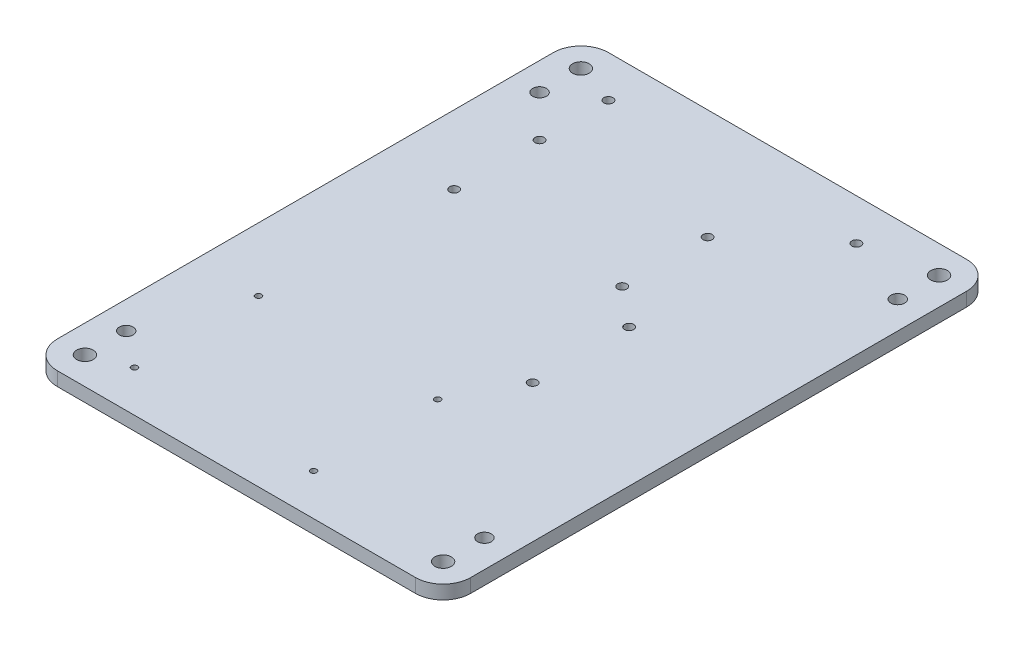
ISO-10303-21;
HEADER;
FILE_DESCRIPTION(('STEP AP214'),'2;1');
FILE_NAME('part.step','',(''),(''),'','','');
FILE_SCHEMA(('AUTOMOTIVE_DESIGN { 1 0 10303 214 1 1 1 1 }'));
ENDSEC;
DATA;
#1=APPLICATION_CONTEXT('core data for automotive mechanical design processes');
#2=APPLICATION_PROTOCOL_DEFINITION('international standard','automotive_design',2000,#1);
#3=PRODUCT_CONTEXT('',#1,'mechanical');
#4=PRODUCT('Part','Part','',(#3));
#5=PRODUCT_RELATED_PRODUCT_CATEGORY('part','',(#4));
#6=PRODUCT_DEFINITION_FORMATION('','',#4);
#7=PRODUCT_DEFINITION_CONTEXT('part definition',#1,'design');
#8=PRODUCT_DEFINITION('design','',#6,#7);
#9=PRODUCT_DEFINITION_SHAPE('','',#8);
#10=(LENGTH_UNIT() NAMED_UNIT(*) SI_UNIT(.MILLI.,.METRE.));
#11=(NAMED_UNIT(*) PLANE_ANGLE_UNIT() SI_UNIT($,.RADIAN.));
#12=(NAMED_UNIT(*) SI_UNIT($,.STERADIAN.) SOLID_ANGLE_UNIT());
#13=UNCERTAINTY_MEASURE_WITH_UNIT(LENGTH_MEASURE(1.E-05),#10,'distance_accuracy_value','');
#14=(GEOMETRIC_REPRESENTATION_CONTEXT(3) GLOBAL_UNCERTAINTY_ASSIGNED_CONTEXT((#13)) GLOBAL_UNIT_ASSIGNED_CONTEXT((#10,
#11,#12)) REPRESENTATION_CONTEXT('',''));
#15=CARTESIAN_POINT('',(0.,0.,0.));
#16=DIRECTION('',(0.,0.,1.));
#17=DIRECTION('',(1.,0.,0.));
#18=AXIS2_PLACEMENT_3D('',#15,#16,#17);
#19=CARTESIAN_POINT('',(0.,10.,0.));
#20=DIRECTION('',(-1.,0.,0.));
#21=DIRECTION('',(0.,0.,1.));
#22=AXIS2_PLACEMENT_3D('',#19,#20,#21);
#23=PLANE('',#22);
#24=DIRECTION('',(0.,0.,1.));
#25=VECTOR('',#24,1.);
#26=CARTESIAN_POINT('',(0.,10.,0.));
#27=LINE('',#26,#25);
#28=CARTESIAN_POINT('',(0.,10.,10.));
#29=VERTEX_POINT('',#28);
#30=CARTESIAN_POINT('',(0.,10.,190.));
#31=VERTEX_POINT('',#30);
#32=EDGE_CURVE('E133',#29,#31,#27,.T.);
#33=ORIENTED_EDGE('',*,*,#32,.T.);
#34=DIRECTION('',(0.,1.,0.));
#35=VECTOR('',#34,1.);
#36=CARTESIAN_POINT('',(0.,10.,190.));
#37=LINE('',#36,#35);
#38=CARTESIAN_POINT('',(0.,15.,190.));
#39=VERTEX_POINT('',#38);
#40=EDGE_CURVE('E111',#31,#39,#37,.T.);
#41=ORIENTED_EDGE('',*,*,#40,.T.);
#42=DIRECTION('',(0.,0.,1.));
#43=VECTOR('',#42,1.);
#44=CARTESIAN_POINT('',(0.,15.,0.));
#45=LINE('',#44,#43);
#46=CARTESIAN_POINT('',(0.,15.,10.));
#47=VERTEX_POINT('',#46);
#48=EDGE_CURVE('E140',#47,#39,#45,.T.);
#49=ORIENTED_EDGE('',*,*,#48,.F.);
#50=DIRECTION('',(0.,1.,0.));
#51=VECTOR('',#50,1.);
#52=CARTESIAN_POINT('',(0.,10.,10.));
#53=LINE('',#52,#51);
#54=EDGE_CURVE('E161',#29,#47,#53,.T.);
#55=ORIENTED_EDGE('',*,*,#54,.F.);
#56=EDGE_LOOP('',(#33,#41,#49,#55));
#57=FACE_BOUND('',#56,.T.);
#58=ADVANCED_FACE('F40',(#57),#23,.T.);
#59=CARTESIAN_POINT('',(0.,10.,0.));
#60=DIRECTION('',(0.,0.,-1.));
#61=DIRECTION('',(-1.,0.,0.));
#62=AXIS2_PLACEMENT_3D('',#59,#60,#61);
#63=PLANE('',#62);
#64=DIRECTION('',(-1.,0.,0.));
#65=VECTOR('',#64,1.);
#66=CARTESIAN_POINT('',(0.,10.,0.));
#67=LINE('',#66,#65);
#68=CARTESIAN_POINT('',(140.,10.,0.));
#69=VERTEX_POINT('',#68);
#70=CARTESIAN_POINT('',(10.,10.,0.));
#71=VERTEX_POINT('',#70);
#72=EDGE_CURVE('E12',#69,#71,#67,.T.);
#73=ORIENTED_EDGE('',*,*,#72,.T.);
#74=DIRECTION('',(0.,1.,0.));
#75=VECTOR('',#74,1.);
#76=CARTESIAN_POINT('',(10.,10.,0.));
#77=LINE('',#76,#75);
#78=CARTESIAN_POINT('',(10.,15.,0.));
#79=VERTEX_POINT('',#78);
#80=EDGE_CURVE('E158',#71,#79,#77,.T.);
#81=ORIENTED_EDGE('',*,*,#80,.T.);
#82=DIRECTION('',(-1.,0.,0.));
#83=VECTOR('',#82,1.);
#84=CARTESIAN_POINT('',(0.,15.,0.));
#85=LINE('',#84,#83);
#86=CARTESIAN_POINT('',(140.,15.,0.));
#87=VERTEX_POINT('',#86);
#88=EDGE_CURVE('E43',#87,#79,#85,.T.);
#89=ORIENTED_EDGE('',*,*,#88,.F.);
#90=DIRECTION('',(0.,1.,0.));
#91=VECTOR('',#90,1.);
#92=CARTESIAN_POINT('',(140.,10.,0.));
#93=LINE('',#92,#91);
#94=EDGE_CURVE('E56',#69,#87,#93,.T.);
#95=ORIENTED_EDGE('',*,*,#94,.F.);
#96=EDGE_LOOP('',(#73,#81,#89,#95));
#97=FACE_BOUND('',#96,.T.);
#98=ADVANCED_FACE('F156',(#97),#63,.T.);
#99=CARTESIAN_POINT('',(150.,10.,0.));
#100=DIRECTION('',(1.,0.,0.));
#101=DIRECTION('',(0.,0.,-1.));
#102=AXIS2_PLACEMENT_3D('',#99,#100,#101);
#103=PLANE('',#102);
#104=DIRECTION('',(0.,0.,-1.));
#105=VECTOR('',#104,1.);
#106=CARTESIAN_POINT('',(150.,10.,0.));
#107=LINE('',#106,#105);
#108=CARTESIAN_POINT('',(150.,10.,190.));
#109=VERTEX_POINT('',#108);
#110=CARTESIAN_POINT('',(150.,10.,10.));
#111=VERTEX_POINT('',#110);
#112=EDGE_CURVE('E48',#109,#111,#107,.T.);
#113=ORIENTED_EDGE('',*,*,#112,.T.);
#114=DIRECTION('',(0.,1.,0.));
#115=VECTOR('',#114,1.);
#116=CARTESIAN_POINT('',(150.,10.,10.));
#117=LINE('',#116,#115);
#118=CARTESIAN_POINT('',(150.,15.,10.));
#119=VERTEX_POINT('',#118);
#120=EDGE_CURVE('E164',#111,#119,#117,.T.);
#121=ORIENTED_EDGE('',*,*,#120,.T.);
#122=DIRECTION('',(0.,0.,-1.));
#123=VECTOR('',#122,1.);
#124=CARTESIAN_POINT('',(150.,15.,0.));
#125=LINE('',#124,#123);
#126=CARTESIAN_POINT('',(150.,15.,190.));
#127=VERTEX_POINT('',#126);
#128=EDGE_CURVE('E144',#127,#119,#125,.T.);
#129=ORIENTED_EDGE('',*,*,#128,.F.);
#130=DIRECTION('',(0.,1.,0.));
#131=VECTOR('',#130,1.);
#132=CARTESIAN_POINT('',(150.,10.,190.));
#133=LINE('',#132,#131);
#134=EDGE_CURVE('E64',#109,#127,#133,.T.);
#135=ORIENTED_EDGE('',*,*,#134,.F.);
#136=EDGE_LOOP('',(#113,#121,#129,#135));
#137=FACE_BOUND('',#136,.T.);
#138=ADVANCED_FACE('F315',(#137),#103,.T.);
#139=CARTESIAN_POINT('',(0.,10.,200.));
#140=DIRECTION('',(0.,0.,1.));
#141=DIRECTION('',(1.,0.,0.));
#142=AXIS2_PLACEMENT_3D('',#139,#140,#141);
#143=PLANE('',#142);
#144=DIRECTION('',(0.,1.,0.));
#145=VECTOR('',#144,1.);
#146=CARTESIAN_POINT('',(10.,10.,200.));
#147=LINE('',#146,#145);
#148=CARTESIAN_POINT('',(10.,10.,200.));
#149=VERTEX_POINT('',#148);
#150=CARTESIAN_POINT('',(10.,15.,200.));
#151=VERTEX_POINT('',#150);
#152=EDGE_CURVE('E108',#149,#151,#147,.T.);
#153=ORIENTED_EDGE('',*,*,#152,.F.);
#154=DIRECTION('',(1.,0.,0.));
#155=VECTOR('',#154,1.);
#156=CARTESIAN_POINT('',(0.,10.,200.));
#157=LINE('',#156,#155);
#158=CARTESIAN_POINT('',(140.,10.,200.));
#159=VERTEX_POINT('',#158);
#160=EDGE_CURVE('E124',#149,#159,#157,.T.);
#161=ORIENTED_EDGE('',*,*,#160,.T.);
#162=DIRECTION('',(0.,1.,0.));
#163=VECTOR('',#162,1.);
#164=CARTESIAN_POINT('',(140.,10.,200.));
#165=LINE('',#164,#163);
#166=CARTESIAN_POINT('',(140.,15.,200.));
#167=VERTEX_POINT('',#166);
#168=EDGE_CURVE('E127',#159,#167,#165,.T.);
#169=ORIENTED_EDGE('',*,*,#168,.T.);
#170=DIRECTION('',(1.,0.,0.));
#171=VECTOR('',#170,1.);
#172=CARTESIAN_POINT('',(0.,15.,200.));
#173=LINE('',#172,#171);
#174=EDGE_CURVE('E126',#151,#167,#173,.T.);
#175=ORIENTED_EDGE('',*,*,#174,.F.);
#176=EDGE_LOOP('',(#153,#161,#169,#175));
#177=FACE_BOUND('',#176,.T.);
#178=ADVANCED_FACE('F122',(#177),#143,.T.);
#179=CARTESIAN_POINT('',(0.,10.,0.));
#180=DIRECTION('',(0.,1.,0.));
#181=DIRECTION('',(0.,0.,1.));
#182=AXIS2_PLACEMENT_3D('',#179,#180,#181);
#183=PLANE('',#182);
#184=CARTESIAN_POINT('',(10.,10.,10.));
#185=DIRECTION('',(0.,1.,0.));
#186=DIRECTION('',(0.,0.,1.));
#187=AXIS2_PLACEMENT_3D('',#184,#185,#186);
#188=CIRCLE('',#187,3.);
#189=CARTESIAN_POINT('',(10.,10.,13.));
#190=VERTEX_POINT('',#189);
#191=EDGE_CURVE('E172',#190,#190,#188,.T.);
#192=ORIENTED_EDGE('',*,*,#191,.T.);
#193=EDGE_LOOP('',(#192));
#194=FACE_BOUND('',#193,.T.);
#195=CARTESIAN_POINT('',(10.,10.,25.));
#196=DIRECTION('',(0.,1.,0.));
#197=DIRECTION('',(0.,0.,1.));
#198=AXIS2_PLACEMENT_3D('',#195,#196,#197);
#199=CIRCLE('',#198,2.5);
#200=CARTESIAN_POINT('',(10.,10.,27.5));
#201=VERTEX_POINT('',#200);
#202=EDGE_CURVE('E179',#201,#201,#199,.T.);
#203=ORIENTED_EDGE('',*,*,#202,.T.);
#204=EDGE_LOOP('',(#203));
#205=FACE_BOUND('',#204,.T.);
#206=CARTESIAN_POINT('',(10.,10.,175.));
#207=DIRECTION('',(0.,1.,0.));
#208=DIRECTION('',(0.,0.,1.));
#209=AXIS2_PLACEMENT_3D('',#206,#207,#208);
#210=CIRCLE('',#209,2.5);
#211=CARTESIAN_POINT('',(10.,10.,177.5));
#212=VERTEX_POINT('',#211);
#213=EDGE_CURVE('E185',#212,#212,#210,.T.);
#214=ORIENTED_EDGE('',*,*,#213,.T.);
#215=EDGE_LOOP('',(#214));
#216=FACE_BOUND('',#215,.T.);
#217=CARTESIAN_POINT('',(10.,10.,190.));
#218=DIRECTION('',(0.,1.,0.));
#219=DIRECTION('',(0.,0.,1.));
#220=AXIS2_PLACEMENT_3D('',#217,#218,#219);
#221=CIRCLE('',#220,3.);
#222=CARTESIAN_POINT('',(10.,10.,193.));
#223=VERTEX_POINT('',#222);
#224=EDGE_CURVE('E191',#223,#223,#221,.T.);
#225=ORIENTED_EDGE('',*,*,#224,.T.);
#226=EDGE_LOOP('',(#225));
#227=FACE_BOUND('',#226,.T.);
#228=CARTESIAN_POINT('',(140.,10.,190.));
#229=DIRECTION('',(0.,1.,0.));
#230=DIRECTION('',(0.,0.,1.));
#231=AXIS2_PLACEMENT_3D('',#228,#229,#230);
#232=CIRCLE('',#231,2.99999999999999);
#233=CARTESIAN_POINT('',(140.,10.,193.));
#234=VERTEX_POINT('',#233);
#235=EDGE_CURVE('E197',#234,#234,#232,.T.);
#236=ORIENTED_EDGE('',*,*,#235,.T.);
#237=EDGE_LOOP('',(#236));
#238=FACE_BOUND('',#237,.T.);
#239=CARTESIAN_POINT('',(140.,10.,175.));
#240=DIRECTION('',(0.,1.,0.));
#241=DIRECTION('',(0.,0.,1.));
#242=AXIS2_PLACEMENT_3D('',#239,#240,#241);
#243=CIRCLE('',#242,2.5);
#244=CARTESIAN_POINT('',(140.,10.,177.5));
#245=VERTEX_POINT('',#244);
#246=EDGE_CURVE('E203',#245,#245,#243,.T.);
#247=ORIENTED_EDGE('',*,*,#246,.T.);
#248=EDGE_LOOP('',(#247));
#249=FACE_BOUND('',#248,.T.);
#250=CARTESIAN_POINT('',(140.,10.,10.));
#251=DIRECTION('',(0.,1.,0.));
#252=DIRECTION('',(0.,0.,1.));
#253=AXIS2_PLACEMENT_3D('',#250,#251,#252);
#254=CIRCLE('',#253,2.99999999999999);
#255=CARTESIAN_POINT('',(140.,10.,13.));
#256=VERTEX_POINT('',#255);
#257=EDGE_CURVE('E209',#256,#256,#254,.T.);
#258=ORIENTED_EDGE('',*,*,#257,.T.);
#259=EDGE_LOOP('',(#258));
#260=FACE_BOUND('',#259,.T.);
#261=CARTESIAN_POINT('',(140.,10.,25.));
#262=DIRECTION('',(0.,1.,0.));
#263=DIRECTION('',(0.,0.,1.));
#264=AXIS2_PLACEMENT_3D('',#261,#262,#263);
#265=CIRCLE('',#264,2.5);
#266=CARTESIAN_POINT('',(140.,10.,27.5));
#267=VERTEX_POINT('',#266);
#268=EDGE_CURVE('E215',#267,#267,#265,.T.);
#269=ORIENTED_EDGE('',*,*,#268,.T.);
#270=EDGE_LOOP('',(#269));
#271=FACE_BOUND('',#270,.T.);
#272=CARTESIAN_POINT('',(88.,10.,185.));
#273=DIRECTION('',(0.,1.,0.));
#274=DIRECTION('',(0.,0.,1.));
#275=AXIS2_PLACEMENT_3D('',#272,#273,#274);
#276=CIRCLE('',#275,1.1);
#277=CARTESIAN_POINT('',(88.,10.,186.1));
#278=VERTEX_POINT('',#277);
#279=EDGE_CURVE('E221',#278,#278,#276,.T.);
#280=ORIENTED_EDGE('',*,*,#279,.T.);
#281=EDGE_LOOP('',(#280));
#282=FACE_BOUND('',#281,.T.);
#283=CARTESIAN_POINT('',(23.,10.,185.));
#284=DIRECTION('',(0.,1.,0.));
#285=DIRECTION('',(0.,0.,1.));
#286=AXIS2_PLACEMENT_3D('',#283,#284,#285);
#287=CIRCLE('',#286,1.09999999999999);
#288=CARTESIAN_POINT('',(23.,10.,186.1));
#289=VERTEX_POINT('',#288);
#290=EDGE_CURVE('E227',#289,#289,#287,.T.);
#291=ORIENTED_EDGE('',*,*,#290,.T.);
#292=EDGE_LOOP('',(#291));
#293=FACE_BOUND('',#292,.T.);
#294=CARTESIAN_POINT('',(23.,10.,140.));
#295=DIRECTION('',(0.,1.,0.));
#296=DIRECTION('',(0.,0.,1.));
#297=AXIS2_PLACEMENT_3D('',#294,#295,#296);
#298=CIRCLE('',#297,1.09999999999999);
#299=CARTESIAN_POINT('',(23.,10.,141.1));
#300=VERTEX_POINT('',#299);
#301=EDGE_CURVE('E233',#300,#300,#298,.T.);
#302=ORIENTED_EDGE('',*,*,#301,.T.);
#303=EDGE_LOOP('',(#302));
#304=FACE_BOUND('',#303,.T.);
#305=CARTESIAN_POINT('',(88.,10.,140.));
#306=DIRECTION('',(0.,1.,0.));
#307=DIRECTION('',(0.,0.,1.));
#308=AXIS2_PLACEMENT_3D('',#305,#306,#307);
#309=CIRCLE('',#308,1.1);
#310=CARTESIAN_POINT('',(88.,10.,141.1));
#311=VERTEX_POINT('',#310);
#312=EDGE_CURVE('E239',#311,#311,#309,.T.);
#313=ORIENTED_EDGE('',*,*,#312,.T.);
#314=EDGE_LOOP('',(#313));
#315=FACE_BOUND('',#314,.T.);
#316=CARTESIAN_POINT('',(100.,10.,117.5));
#317=DIRECTION('',(0.,1.,0.));
#318=DIRECTION('',(0.,0.,1.));
#319=AXIS2_PLACEMENT_3D('',#316,#317,#318);
#320=CIRCLE('',#319,1.65);
#321=CARTESIAN_POINT('',(100.,10.,119.15));
#322=VERTEX_POINT('',#321);
#323=EDGE_CURVE('E245',#322,#322,#320,.T.);
#324=ORIENTED_EDGE('',*,*,#323,.T.);
#325=EDGE_LOOP('',(#324));
#326=FACE_BOUND('',#325,.T.);
#327=CARTESIAN_POINT('',(100.,10.,82.5));
#328=DIRECTION('',(0.,1.,0.));
#329=DIRECTION('',(0.,0.,1.));
#330=AXIS2_PLACEMENT_3D('',#327,#328,#329);
#331=CIRCLE('',#330,1.65);
#332=CARTESIAN_POINT('',(100.,10.,84.15));
#333=VERTEX_POINT('',#332);
#334=EDGE_CURVE('E251',#333,#333,#331,.T.);
#335=ORIENTED_EDGE('',*,*,#334,.T.);
#336=EDGE_LOOP('',(#335));
#337=FACE_BOUND('',#336,.T.);
#338=CARTESIAN_POINT('',(25.,10.,15.));
#339=DIRECTION('',(0.,1.,0.));
#340=DIRECTION('',(0.,0.,1.));
#341=AXIS2_PLACEMENT_3D('',#338,#339,#340);
#342=CIRCLE('',#341,1.65);
#343=CARTESIAN_POINT('',(25.,10.,16.65));
#344=VERTEX_POINT('',#343);
#345=EDGE_CURVE('E257',#344,#344,#342,.T.);
#346=ORIENTED_EDGE('',*,*,#345,.T.);
#347=EDGE_LOOP('',(#346));
#348=FACE_BOUND('',#347,.T.);
#349=CARTESIAN_POINT('',(115.,10.,15.));
#350=DIRECTION('',(0.,1.,0.));
#351=DIRECTION('',(0.,0.,1.));
#352=AXIS2_PLACEMENT_3D('',#349,#350,#351);
#353=CIRCLE('',#352,1.65);
#354=CARTESIAN_POINT('',(115.,10.,16.65));
#355=VERTEX_POINT('',#354);
#356=EDGE_CURVE('E263',#355,#355,#353,.T.);
#357=ORIENTED_EDGE('',*,*,#356,.T.);
#358=EDGE_LOOP('',(#357));
#359=FACE_BOUND('',#358,.T.);
#360=CARTESIAN_POINT('',(25.,10.,71.));
#361=DIRECTION('',(0.,1.,0.));
#362=DIRECTION('',(0.,0.,1.));
#363=AXIS2_PLACEMENT_3D('',#360,#361,#362);
#364=CIRCLE('',#363,1.65);
#365=CARTESIAN_POINT('',(25.,10.,72.65));
#366=VERTEX_POINT('',#365);
#367=EDGE_CURVE('E269',#366,#366,#364,.T.);
#368=ORIENTED_EDGE('',*,*,#367,.T.);
#369=EDGE_LOOP('',(#368));
#370=FACE_BOUND('',#369,.T.);
#371=CARTESIAN_POINT('',(86.,10.,71.));
#372=DIRECTION('',(0.,1.,0.));
#373=DIRECTION('',(0.,0.,1.));
#374=AXIS2_PLACEMENT_3D('',#371,#372,#373);
#375=CIRCLE('',#374,1.65);
#376=CARTESIAN_POINT('',(86.,10.,72.65));
#377=VERTEX_POINT('',#376);
#378=EDGE_CURVE('E275',#377,#377,#375,.T.);
#379=ORIENTED_EDGE('',*,*,#378,.T.);
#380=EDGE_LOOP('',(#379));
#381=FACE_BOUND('',#380,.T.);
#382=CARTESIAN_POINT('',(86.,10.,40.));
#383=DIRECTION('',(0.,1.,0.));
#384=DIRECTION('',(0.,0.,1.));
#385=AXIS2_PLACEMENT_3D('',#382,#383,#384);
#386=CIRCLE('',#385,1.65);
#387=CARTESIAN_POINT('',(86.,10.,41.65));
#388=VERTEX_POINT('',#387);
#389=EDGE_CURVE('E281',#388,#388,#386,.T.);
#390=ORIENTED_EDGE('',*,*,#389,.T.);
#391=EDGE_LOOP('',(#390));
#392=FACE_BOUND('',#391,.T.);
#393=CARTESIAN_POINT('',(25.,10.,40.));
#394=DIRECTION('',(0.,1.,0.));
#395=DIRECTION('',(0.,0.,1.));
#396=AXIS2_PLACEMENT_3D('',#393,#394,#395);
#397=CIRCLE('',#396,1.65);
#398=CARTESIAN_POINT('',(25.,10.,41.65));
#399=VERTEX_POINT('',#398);
#400=EDGE_CURVE('E143',#399,#399,#397,.T.);
#401=ORIENTED_EDGE('',*,*,#400,.T.);
#402=EDGE_LOOP('',(#401));
#403=FACE_BOUND('',#402,.T.);
#404=CARTESIAN_POINT('',(10.,10.,190.));
#405=DIRECTION('',(0.,1.,0.));
#406=DIRECTION('',(0.,0.,1.));
#407=AXIS2_PLACEMENT_3D('',#404,#405,#406);
#408=CIRCLE('',#407,10.);
#409=EDGE_CURVE('E105',#31,#149,#408,.T.);
#410=ORIENTED_EDGE('',*,*,#409,.F.);
#411=ORIENTED_EDGE('',*,*,#32,.F.);
#412=CARTESIAN_POINT('',(10.,10.,10.));
#413=DIRECTION('',(0.,1.,0.));
#414=DIRECTION('',(0.,0.,-1.));
#415=AXIS2_PLACEMENT_3D('',#412,#413,#414);
#416=CIRCLE('',#415,10.);
#417=EDGE_CURVE('E128',#71,#29,#416,.T.);
#418=ORIENTED_EDGE('',*,*,#417,.F.);
#419=ORIENTED_EDGE('',*,*,#72,.F.);
#420=CARTESIAN_POINT('',(140.,10.,10.));
#421=DIRECTION('',(0.,1.,0.));
#422=DIRECTION('',(0.,0.,1.));
#423=AXIS2_PLACEMENT_3D('',#420,#421,#422);
#424=CIRCLE('',#423,10.);
#425=EDGE_CURVE('E318',#111,#69,#424,.T.);
#426=ORIENTED_EDGE('',*,*,#425,.F.);
#427=ORIENTED_EDGE('',*,*,#112,.F.);
#428=CARTESIAN_POINT('',(140.,10.,190.));
#429=DIRECTION('',(0.,1.,0.));
#430=DIRECTION('',(0.,0.,-1.));
#431=AXIS2_PLACEMENT_3D('',#428,#429,#430);
#432=CIRCLE('',#431,10.);
#433=EDGE_CURVE('E116',#159,#109,#432,.T.);
#434=ORIENTED_EDGE('',*,*,#433,.F.);
#435=ORIENTED_EDGE('',*,*,#160,.F.);
#436=EDGE_LOOP('',(#410,#411,#418,#419,#426,#427,#434,#435));
#437=FACE_BOUND('',#436,.T.);
#438=ADVANCED_FACE('F131',(#194,#205,#216,#227,#238,#249,#260,#271,#282,#293,#304,#315,#326,
#337,#348,#359,#370,#381,#392,#403,#437),#183,.F.);
#439=CARTESIAN_POINT('',(0.,15.,0.));
#440=DIRECTION('',(0.,1.,0.));
#441=DIRECTION('',(0.,0.,1.));
#442=AXIS2_PLACEMENT_3D('',#439,#440,#441);
#443=PLANE('',#442);
#444=CARTESIAN_POINT('',(10.,15.,10.));
#445=DIRECTION('',(0.,1.,0.));
#446=DIRECTION('',(0.,0.,1.));
#447=AXIS2_PLACEMENT_3D('',#444,#445,#446);
#448=CIRCLE('',#447,3.);
#449=CARTESIAN_POINT('',(10.,15.,13.));
#450=VERTEX_POINT('',#449);
#451=EDGE_CURVE('E176',#450,#450,#448,.T.);
#452=ORIENTED_EDGE('',*,*,#451,.F.);
#453=EDGE_LOOP('',(#452));
#454=FACE_BOUND('',#453,.T.);
#455=CARTESIAN_POINT('',(10.,15.,25.));
#456=DIRECTION('',(0.,1.,0.));
#457=DIRECTION('',(0.,0.,1.));
#458=AXIS2_PLACEMENT_3D('',#455,#456,#457);
#459=CIRCLE('',#458,2.5);
#460=CARTESIAN_POINT('',(10.,15.,27.5));
#461=VERTEX_POINT('',#460);
#462=EDGE_CURVE('E175',#461,#461,#459,.T.);
#463=ORIENTED_EDGE('',*,*,#462,.F.);
#464=EDGE_LOOP('',(#463));
#465=FACE_BOUND('',#464,.T.);
#466=CARTESIAN_POINT('',(10.,15.,175.));
#467=DIRECTION('',(0.,1.,0.));
#468=DIRECTION('',(0.,0.,1.));
#469=AXIS2_PLACEMENT_3D('',#466,#467,#468);
#470=CIRCLE('',#469,2.5);
#471=CARTESIAN_POINT('',(10.,15.,177.5));
#472=VERTEX_POINT('',#471);
#473=EDGE_CURVE('E182',#472,#472,#470,.T.);
#474=ORIENTED_EDGE('',*,*,#473,.F.);
#475=EDGE_LOOP('',(#474));
#476=FACE_BOUND('',#475,.T.);
#477=CARTESIAN_POINT('',(10.,15.,190.));
#478=DIRECTION('',(0.,1.,0.));
#479=DIRECTION('',(0.,0.,1.));
#480=AXIS2_PLACEMENT_3D('',#477,#478,#479);
#481=CIRCLE('',#480,3.);
#482=CARTESIAN_POINT('',(10.,15.,193.));
#483=VERTEX_POINT('',#482);
#484=EDGE_CURVE('E188',#483,#483,#481,.T.);
#485=ORIENTED_EDGE('',*,*,#484,.F.);
#486=EDGE_LOOP('',(#485));
#487=FACE_BOUND('',#486,.T.);
#488=CARTESIAN_POINT('',(140.,15.,190.));
#489=DIRECTION('',(0.,1.,0.));
#490=DIRECTION('',(0.,0.,1.));
#491=AXIS2_PLACEMENT_3D('',#488,#489,#490);
#492=CIRCLE('',#491,2.99999999999999);
#493=CARTESIAN_POINT('',(140.,15.,193.));
#494=VERTEX_POINT('',#493);
#495=EDGE_CURVE('E194',#494,#494,#492,.T.);
#496=ORIENTED_EDGE('',*,*,#495,.F.);
#497=EDGE_LOOP('',(#496));
#498=FACE_BOUND('',#497,.T.);
#499=CARTESIAN_POINT('',(140.,15.,175.));
#500=DIRECTION('',(0.,1.,0.));
#501=DIRECTION('',(0.,0.,1.));
#502=AXIS2_PLACEMENT_3D('',#499,#500,#501);
#503=CIRCLE('',#502,2.5);
#504=CARTESIAN_POINT('',(140.,15.,177.5));
#505=VERTEX_POINT('',#504);
#506=EDGE_CURVE('E200',#505,#505,#503,.T.);
#507=ORIENTED_EDGE('',*,*,#506,.F.);
#508=EDGE_LOOP('',(#507));
#509=FACE_BOUND('',#508,.T.);
#510=CARTESIAN_POINT('',(140.,15.,10.));
#511=DIRECTION('',(0.,1.,0.));
#512=DIRECTION('',(0.,0.,1.));
#513=AXIS2_PLACEMENT_3D('',#510,#511,#512);
#514=CIRCLE('',#513,2.99999999999999);
#515=CARTESIAN_POINT('',(140.,15.,13.));
#516=VERTEX_POINT('',#515);
#517=EDGE_CURVE('E206',#516,#516,#514,.T.);
#518=ORIENTED_EDGE('',*,*,#517,.F.);
#519=EDGE_LOOP('',(#518));
#520=FACE_BOUND('',#519,.T.);
#521=CARTESIAN_POINT('',(140.,15.,25.));
#522=DIRECTION('',(0.,1.,0.));
#523=DIRECTION('',(0.,0.,1.));
#524=AXIS2_PLACEMENT_3D('',#521,#522,#523);
#525=CIRCLE('',#524,2.5);
#526=CARTESIAN_POINT('',(140.,15.,27.5));
#527=VERTEX_POINT('',#526);
#528=EDGE_CURVE('E212',#527,#527,#525,.T.);
#529=ORIENTED_EDGE('',*,*,#528,.F.);
#530=EDGE_LOOP('',(#529));
#531=FACE_BOUND('',#530,.T.);
#532=CARTESIAN_POINT('',(88.,15.,185.));
#533=DIRECTION('',(0.,1.,0.));
#534=DIRECTION('',(0.,0.,1.));
#535=AXIS2_PLACEMENT_3D('',#532,#533,#534);
#536=CIRCLE('',#535,1.1);
#537=CARTESIAN_POINT('',(88.,15.,186.1));
#538=VERTEX_POINT('',#537);
#539=EDGE_CURVE('E218',#538,#538,#536,.T.);
#540=ORIENTED_EDGE('',*,*,#539,.F.);
#541=EDGE_LOOP('',(#540));
#542=FACE_BOUND('',#541,.T.);
#543=CARTESIAN_POINT('',(23.,15.,185.));
#544=DIRECTION('',(0.,1.,0.));
#545=DIRECTION('',(0.,0.,1.));
#546=AXIS2_PLACEMENT_3D('',#543,#544,#545);
#547=CIRCLE('',#546,1.09999999999999);
#548=CARTESIAN_POINT('',(23.,15.,186.1));
#549=VERTEX_POINT('',#548);
#550=EDGE_CURVE('E224',#549,#549,#547,.T.);
#551=ORIENTED_EDGE('',*,*,#550,.F.);
#552=EDGE_LOOP('',(#551));
#553=FACE_BOUND('',#552,.T.);
#554=CARTESIAN_POINT('',(23.,15.,140.));
#555=DIRECTION('',(0.,1.,0.));
#556=DIRECTION('',(0.,0.,1.));
#557=AXIS2_PLACEMENT_3D('',#554,#555,#556);
#558=CIRCLE('',#557,1.09999999999999);
#559=CARTESIAN_POINT('',(23.,15.,141.1));
#560=VERTEX_POINT('',#559);
#561=EDGE_CURVE('E230',#560,#560,#558,.T.);
#562=ORIENTED_EDGE('',*,*,#561,.F.);
#563=EDGE_LOOP('',(#562));
#564=FACE_BOUND('',#563,.T.);
#565=CARTESIAN_POINT('',(88.,15.,140.));
#566=DIRECTION('',(0.,1.,0.));
#567=DIRECTION('',(0.,0.,1.));
#568=AXIS2_PLACEMENT_3D('',#565,#566,#567);
#569=CIRCLE('',#568,1.1);
#570=CARTESIAN_POINT('',(88.,15.,141.1));
#571=VERTEX_POINT('',#570);
#572=EDGE_CURVE('E236',#571,#571,#569,.T.);
#573=ORIENTED_EDGE('',*,*,#572,.F.);
#574=EDGE_LOOP('',(#573));
#575=FACE_BOUND('',#574,.T.);
#576=CARTESIAN_POINT('',(100.,15.,117.5));
#577=DIRECTION('',(0.,1.,0.));
#578=DIRECTION('',(0.,0.,1.));
#579=AXIS2_PLACEMENT_3D('',#576,#577,#578);
#580=CIRCLE('',#579,1.65);
#581=CARTESIAN_POINT('',(100.,15.,119.15));
#582=VERTEX_POINT('',#581);
#583=EDGE_CURVE('E242',#582,#582,#580,.T.);
#584=ORIENTED_EDGE('',*,*,#583,.F.);
#585=EDGE_LOOP('',(#584));
#586=FACE_BOUND('',#585,.T.);
#587=CARTESIAN_POINT('',(100.,15.,82.5));
#588=DIRECTION('',(0.,1.,0.));
#589=DIRECTION('',(0.,0.,1.));
#590=AXIS2_PLACEMENT_3D('',#587,#588,#589);
#591=CIRCLE('',#590,1.65);
#592=CARTESIAN_POINT('',(100.,15.,84.15));
#593=VERTEX_POINT('',#592);
#594=EDGE_CURVE('E248',#593,#593,#591,.T.);
#595=ORIENTED_EDGE('',*,*,#594,.F.);
#596=EDGE_LOOP('',(#595));
#597=FACE_BOUND('',#596,.T.);
#598=CARTESIAN_POINT('',(25.,15.,15.));
#599=DIRECTION('',(0.,1.,0.));
#600=DIRECTION('',(0.,0.,1.));
#601=AXIS2_PLACEMENT_3D('',#598,#599,#600);
#602=CIRCLE('',#601,1.65);
#603=CARTESIAN_POINT('',(25.,15.,16.65));
#604=VERTEX_POINT('',#603);
#605=EDGE_CURVE('E254',#604,#604,#602,.T.);
#606=ORIENTED_EDGE('',*,*,#605,.F.);
#607=EDGE_LOOP('',(#606));
#608=FACE_BOUND('',#607,.T.);
#609=CARTESIAN_POINT('',(115.,15.,15.));
#610=DIRECTION('',(0.,1.,0.));
#611=DIRECTION('',(0.,0.,1.));
#612=AXIS2_PLACEMENT_3D('',#609,#610,#611);
#613=CIRCLE('',#612,1.65);
#614=CARTESIAN_POINT('',(115.,15.,16.65));
#615=VERTEX_POINT('',#614);
#616=EDGE_CURVE('E260',#615,#615,#613,.T.);
#617=ORIENTED_EDGE('',*,*,#616,.F.);
#618=EDGE_LOOP('',(#617));
#619=FACE_BOUND('',#618,.T.);
#620=CARTESIAN_POINT('',(25.,15.,71.));
#621=DIRECTION('',(0.,1.,0.));
#622=DIRECTION('',(0.,0.,1.));
#623=AXIS2_PLACEMENT_3D('',#620,#621,#622);
#624=CIRCLE('',#623,1.65);
#625=CARTESIAN_POINT('',(25.,15.,72.65));
#626=VERTEX_POINT('',#625);
#627=EDGE_CURVE('E266',#626,#626,#624,.T.);
#628=ORIENTED_EDGE('',*,*,#627,.F.);
#629=EDGE_LOOP('',(#628));
#630=FACE_BOUND('',#629,.T.);
#631=CARTESIAN_POINT('',(86.,15.,71.));
#632=DIRECTION('',(0.,1.,0.));
#633=DIRECTION('',(0.,0.,1.));
#634=AXIS2_PLACEMENT_3D('',#631,#632,#633);
#635=CIRCLE('',#634,1.65);
#636=CARTESIAN_POINT('',(86.,15.,72.65));
#637=VERTEX_POINT('',#636);
#638=EDGE_CURVE('E272',#637,#637,#635,.T.);
#639=ORIENTED_EDGE('',*,*,#638,.F.);
#640=EDGE_LOOP('',(#639));
#641=FACE_BOUND('',#640,.T.);
#642=CARTESIAN_POINT('',(86.,15.,40.));
#643=DIRECTION('',(0.,1.,0.));
#644=DIRECTION('',(0.,0.,1.));
#645=AXIS2_PLACEMENT_3D('',#642,#643,#644);
#646=CIRCLE('',#645,1.65);
#647=CARTESIAN_POINT('',(86.,15.,41.65));
#648=VERTEX_POINT('',#647);
#649=EDGE_CURVE('E278',#648,#648,#646,.T.);
#650=ORIENTED_EDGE('',*,*,#649,.F.);
#651=EDGE_LOOP('',(#650));
#652=FACE_BOUND('',#651,.T.);
#653=CARTESIAN_POINT('',(25.,15.,40.));
#654=DIRECTION('',(0.,1.,0.));
#655=DIRECTION('',(0.,0.,1.));
#656=AXIS2_PLACEMENT_3D('',#653,#654,#655);
#657=CIRCLE('',#656,1.65);
#658=CARTESIAN_POINT('',(25.,15.,41.65));
#659=VERTEX_POINT('',#658);
#660=EDGE_CURVE('E284',#659,#659,#657,.T.);
#661=ORIENTED_EDGE('',*,*,#660,.F.);
#662=EDGE_LOOP('',(#661));
#663=FACE_BOUND('',#662,.T.);
#664=ORIENTED_EDGE('',*,*,#48,.T.);
#665=CARTESIAN_POINT('',(10.,15.,190.));
#666=DIRECTION('',(0.,1.,0.));
#667=DIRECTION('',(0.,0.,1.));
#668=AXIS2_PLACEMENT_3D('',#665,#666,#667);
#669=CIRCLE('',#668,10.);
#670=EDGE_CURVE('E323',#39,#151,#669,.T.);
#671=ORIENTED_EDGE('',*,*,#670,.T.);
#672=ORIENTED_EDGE('',*,*,#174,.T.);
#673=CARTESIAN_POINT('',(140.,15.,190.));
#674=DIRECTION('',(0.,1.,0.));
#675=DIRECTION('',(0.,0.,-1.));
#676=AXIS2_PLACEMENT_3D('',#673,#674,#675);
#677=CIRCLE('',#676,10.);
#678=EDGE_CURVE('E325',#167,#127,#677,.T.);
#679=ORIENTED_EDGE('',*,*,#678,.T.);
#680=ORIENTED_EDGE('',*,*,#128,.T.);
#681=CARTESIAN_POINT('',(140.,15.,10.));
#682=DIRECTION('',(0.,1.,0.));
#683=DIRECTION('',(0.,0.,1.));
#684=AXIS2_PLACEMENT_3D('',#681,#682,#683);
#685=CIRCLE('',#684,10.);
#686=EDGE_CURVE('E153',#119,#87,#685,.T.);
#687=ORIENTED_EDGE('',*,*,#686,.T.);
#688=ORIENTED_EDGE('',*,*,#88,.T.);
#689=CARTESIAN_POINT('',(10.,15.,10.));
#690=DIRECTION('',(0.,1.,0.));
#691=DIRECTION('',(0.,0.,-1.));
#692=AXIS2_PLACEMENT_3D('',#689,#690,#691);
#693=CIRCLE('',#692,10.);
#694=EDGE_CURVE('E117',#79,#47,#693,.T.);
#695=ORIENTED_EDGE('',*,*,#694,.T.);
#696=EDGE_LOOP('',(#664,#671,#672,#679,#680,#687,#688,#695));
#697=FACE_BOUND('',#696,.T.);
#698=ADVANCED_FACE('F151',(#454,#465,#476,#487,#498,#509,#520,#531,#542,#553,#564,#575,#586,
#597,#608,#619,#630,#641,#652,#663,#697),#443,.T.);
#699=CARTESIAN_POINT('',(25.,10.,40.));
#700=DIRECTION('',(0.,1.,0.));
#701=DIRECTION('',(0.,0.,1.));
#702=AXIS2_PLACEMENT_3D('',#699,#700,#701);
#703=CYLINDRICAL_SURFACE('',#702,1.65);
#704=ORIENTED_EDGE('',*,*,#400,.F.);
#705=EDGE_LOOP('',(#704));
#706=FACE_BOUND('',#705,.T.);
#707=ORIENTED_EDGE('',*,*,#660,.T.);
#708=EDGE_LOOP('',(#707));
#709=FACE_BOUND('',#708,.T.);
#710=ADVANCED_FACE('F291',(#706,#709),#703,.F.);
#711=CARTESIAN_POINT('',(86.,10.,40.));
#712=DIRECTION('',(0.,1.,0.));
#713=DIRECTION('',(0.,0.,1.));
#714=AXIS2_PLACEMENT_3D('',#711,#712,#713);
#715=CYLINDRICAL_SURFACE('',#714,1.65);
#716=ORIENTED_EDGE('',*,*,#389,.F.);
#717=EDGE_LOOP('',(#716));
#718=FACE_BOUND('',#717,.T.);
#719=ORIENTED_EDGE('',*,*,#649,.T.);
#720=EDGE_LOOP('',(#719));
#721=FACE_BOUND('',#720,.T.);
#722=ADVANCED_FACE('F301',(#718,#721),#715,.F.);
#723=CARTESIAN_POINT('',(86.,10.,71.));
#724=DIRECTION('',(0.,1.,0.));
#725=DIRECTION('',(0.,0.,1.));
#726=AXIS2_PLACEMENT_3D('',#723,#724,#725);
#727=CYLINDRICAL_SURFACE('',#726,1.65);
#728=ORIENTED_EDGE('',*,*,#378,.F.);
#729=EDGE_LOOP('',(#728));
#730=FACE_BOUND('',#729,.T.);
#731=ORIENTED_EDGE('',*,*,#638,.T.);
#732=EDGE_LOOP('',(#731));
#733=FACE_BOUND('',#732,.T.);
#734=ADVANCED_FACE('F408',(#730,#733),#727,.F.);
#735=CARTESIAN_POINT('',(25.,10.,71.));
#736=DIRECTION('',(0.,1.,0.));
#737=DIRECTION('',(0.,0.,1.));
#738=AXIS2_PLACEMENT_3D('',#735,#736,#737);
#739=CYLINDRICAL_SURFACE('',#738,1.65);
#740=ORIENTED_EDGE('',*,*,#367,.F.);
#741=EDGE_LOOP('',(#740));
#742=FACE_BOUND('',#741,.T.);
#743=ORIENTED_EDGE('',*,*,#627,.T.);
#744=EDGE_LOOP('',(#743));
#745=FACE_BOUND('',#744,.T.);
#746=ADVANCED_FACE('F404',(#742,#745),#739,.F.);
#747=CARTESIAN_POINT('',(115.,10.,15.));
#748=DIRECTION('',(0.,1.,0.));
#749=DIRECTION('',(0.,0.,1.));
#750=AXIS2_PLACEMENT_3D('',#747,#748,#749);
#751=CYLINDRICAL_SURFACE('',#750,1.65);
#752=ORIENTED_EDGE('',*,*,#356,.F.);
#753=EDGE_LOOP('',(#752));
#754=FACE_BOUND('',#753,.T.);
#755=ORIENTED_EDGE('',*,*,#616,.T.);
#756=EDGE_LOOP('',(#755));
#757=FACE_BOUND('',#756,.T.);
#758=ADVANCED_FACE('F400',(#754,#757),#751,.F.);
#759=CARTESIAN_POINT('',(25.,10.,15.));
#760=DIRECTION('',(0.,1.,0.));
#761=DIRECTION('',(0.,0.,1.));
#762=AXIS2_PLACEMENT_3D('',#759,#760,#761);
#763=CYLINDRICAL_SURFACE('',#762,1.65);
#764=ORIENTED_EDGE('',*,*,#345,.F.);
#765=EDGE_LOOP('',(#764));
#766=FACE_BOUND('',#765,.T.);
#767=ORIENTED_EDGE('',*,*,#605,.T.);
#768=EDGE_LOOP('',(#767));
#769=FACE_BOUND('',#768,.T.);
#770=ADVANCED_FACE('F396',(#766,#769),#763,.F.);
#771=CARTESIAN_POINT('',(100.,10.,82.5));
#772=DIRECTION('',(0.,1.,0.));
#773=DIRECTION('',(0.,0.,1.));
#774=AXIS2_PLACEMENT_3D('',#771,#772,#773);
#775=CYLINDRICAL_SURFACE('',#774,1.65);
#776=ORIENTED_EDGE('',*,*,#334,.F.);
#777=EDGE_LOOP('',(#776));
#778=FACE_BOUND('',#777,.T.);
#779=ORIENTED_EDGE('',*,*,#594,.T.);
#780=EDGE_LOOP('',(#779));
#781=FACE_BOUND('',#780,.T.);
#782=ADVANCED_FACE('F392',(#778,#781),#775,.F.);
#783=CARTESIAN_POINT('',(100.,10.,117.5));
#784=DIRECTION('',(0.,1.,0.));
#785=DIRECTION('',(0.,0.,1.));
#786=AXIS2_PLACEMENT_3D('',#783,#784,#785);
#787=CYLINDRICAL_SURFACE('',#786,1.65);
#788=ORIENTED_EDGE('',*,*,#323,.F.);
#789=EDGE_LOOP('',(#788));
#790=FACE_BOUND('',#789,.T.);
#791=ORIENTED_EDGE('',*,*,#583,.T.);
#792=EDGE_LOOP('',(#791));
#793=FACE_BOUND('',#792,.T.);
#794=ADVANCED_FACE('F388',(#790,#793),#787,.F.);
#795=CARTESIAN_POINT('',(88.,10.,140.));
#796=DIRECTION('',(0.,1.,0.));
#797=DIRECTION('',(0.,0.,1.));
#798=AXIS2_PLACEMENT_3D('',#795,#796,#797);
#799=CYLINDRICAL_SURFACE('',#798,1.1);
#800=ORIENTED_EDGE('',*,*,#312,.F.);
#801=EDGE_LOOP('',(#800));
#802=FACE_BOUND('',#801,.T.);
#803=ORIENTED_EDGE('',*,*,#572,.T.);
#804=EDGE_LOOP('',(#803));
#805=FACE_BOUND('',#804,.T.);
#806=ADVANCED_FACE('F384',(#802,#805),#799,.F.);
#807=CARTESIAN_POINT('',(23.,10.,140.));
#808=DIRECTION('',(0.,1.,0.));
#809=DIRECTION('',(0.,0.,1.));
#810=AXIS2_PLACEMENT_3D('',#807,#808,#809);
#811=CYLINDRICAL_SURFACE('',#810,1.09999999999999);
#812=ORIENTED_EDGE('',*,*,#301,.F.);
#813=EDGE_LOOP('',(#812));
#814=FACE_BOUND('',#813,.T.);
#815=ORIENTED_EDGE('',*,*,#561,.T.);
#816=EDGE_LOOP('',(#815));
#817=FACE_BOUND('',#816,.T.);
#818=ADVANCED_FACE('F380',(#814,#817),#811,.F.);
#819=CARTESIAN_POINT('',(23.,10.,185.));
#820=DIRECTION('',(0.,1.,0.));
#821=DIRECTION('',(0.,0.,1.));
#822=AXIS2_PLACEMENT_3D('',#819,#820,#821);
#823=CYLINDRICAL_SURFACE('',#822,1.09999999999999);
#824=ORIENTED_EDGE('',*,*,#290,.F.);
#825=EDGE_LOOP('',(#824));
#826=FACE_BOUND('',#825,.T.);
#827=ORIENTED_EDGE('',*,*,#550,.T.);
#828=EDGE_LOOP('',(#827));
#829=FACE_BOUND('',#828,.T.);
#830=ADVANCED_FACE('F376',(#826,#829),#823,.F.);
#831=CARTESIAN_POINT('',(88.,10.,185.));
#832=DIRECTION('',(0.,1.,0.));
#833=DIRECTION('',(0.,0.,1.));
#834=AXIS2_PLACEMENT_3D('',#831,#832,#833);
#835=CYLINDRICAL_SURFACE('',#834,1.1);
#836=ORIENTED_EDGE('',*,*,#279,.F.);
#837=EDGE_LOOP('',(#836));
#838=FACE_BOUND('',#837,.T.);
#839=ORIENTED_EDGE('',*,*,#539,.T.);
#840=EDGE_LOOP('',(#839));
#841=FACE_BOUND('',#840,.T.);
#842=ADVANCED_FACE('F372',(#838,#841),#835,.F.);
#843=CARTESIAN_POINT('',(140.,10.,25.));
#844=DIRECTION('',(0.,1.,0.));
#845=DIRECTION('',(0.,0.,1.));
#846=AXIS2_PLACEMENT_3D('',#843,#844,#845);
#847=CYLINDRICAL_SURFACE('',#846,2.5);
#848=ORIENTED_EDGE('',*,*,#268,.F.);
#849=EDGE_LOOP('',(#848));
#850=FACE_BOUND('',#849,.T.);
#851=ORIENTED_EDGE('',*,*,#528,.T.);
#852=EDGE_LOOP('',(#851));
#853=FACE_BOUND('',#852,.T.);
#854=ADVANCED_FACE('F368',(#850,#853),#847,.F.);
#855=CARTESIAN_POINT('',(140.,10.,10.));
#856=DIRECTION('',(0.,1.,0.));
#857=DIRECTION('',(0.,0.,1.));
#858=AXIS2_PLACEMENT_3D('',#855,#856,#857);
#859=CYLINDRICAL_SURFACE('',#858,2.99999999999999);
#860=ORIENTED_EDGE('',*,*,#257,.F.);
#861=EDGE_LOOP('',(#860));
#862=FACE_BOUND('',#861,.T.);
#863=ORIENTED_EDGE('',*,*,#517,.T.);
#864=EDGE_LOOP('',(#863));
#865=FACE_BOUND('',#864,.T.);
#866=ADVANCED_FACE('F364',(#862,#865),#859,.F.);
#867=CARTESIAN_POINT('',(140.,10.,175.));
#868=DIRECTION('',(0.,1.,0.));
#869=DIRECTION('',(0.,0.,1.));
#870=AXIS2_PLACEMENT_3D('',#867,#868,#869);
#871=CYLINDRICAL_SURFACE('',#870,2.5);
#872=ORIENTED_EDGE('',*,*,#246,.F.);
#873=EDGE_LOOP('',(#872));
#874=FACE_BOUND('',#873,.T.);
#875=ORIENTED_EDGE('',*,*,#506,.T.);
#876=EDGE_LOOP('',(#875));
#877=FACE_BOUND('',#876,.T.);
#878=ADVANCED_FACE('F360',(#874,#877),#871,.F.);
#879=CARTESIAN_POINT('',(140.,10.,190.));
#880=DIRECTION('',(0.,1.,0.));
#881=DIRECTION('',(0.,0.,1.));
#882=AXIS2_PLACEMENT_3D('',#879,#880,#881);
#883=CYLINDRICAL_SURFACE('',#882,2.99999999999999);
#884=ORIENTED_EDGE('',*,*,#235,.F.);
#885=EDGE_LOOP('',(#884));
#886=FACE_BOUND('',#885,.T.);
#887=ORIENTED_EDGE('',*,*,#495,.T.);
#888=EDGE_LOOP('',(#887));
#889=FACE_BOUND('',#888,.T.);
#890=ADVANCED_FACE('F356',(#886,#889),#883,.F.);
#891=CARTESIAN_POINT('',(10.,10.,190.));
#892=DIRECTION('',(0.,1.,0.));
#893=DIRECTION('',(0.,0.,1.));
#894=AXIS2_PLACEMENT_3D('',#891,#892,#893);
#895=CYLINDRICAL_SURFACE('',#894,3.);
#896=ORIENTED_EDGE('',*,*,#224,.F.);
#897=EDGE_LOOP('',(#896));
#898=FACE_BOUND('',#897,.T.);
#899=ORIENTED_EDGE('',*,*,#484,.T.);
#900=EDGE_LOOP('',(#899));
#901=FACE_BOUND('',#900,.T.);
#902=ADVANCED_FACE('F352',(#898,#901),#895,.F.);
#903=CARTESIAN_POINT('',(10.,10.,175.));
#904=DIRECTION('',(0.,1.,0.));
#905=DIRECTION('',(0.,0.,1.));
#906=AXIS2_PLACEMENT_3D('',#903,#904,#905);
#907=CYLINDRICAL_SURFACE('',#906,2.5);
#908=ORIENTED_EDGE('',*,*,#213,.F.);
#909=EDGE_LOOP('',(#908));
#910=FACE_BOUND('',#909,.T.);
#911=ORIENTED_EDGE('',*,*,#473,.T.);
#912=EDGE_LOOP('',(#911));
#913=FACE_BOUND('',#912,.T.);
#914=ADVANCED_FACE('F348',(#910,#913),#907,.F.);
#915=CARTESIAN_POINT('',(10.,10.,25.));
#916=DIRECTION('',(0.,1.,0.));
#917=DIRECTION('',(0.,0.,1.));
#918=AXIS2_PLACEMENT_3D('',#915,#916,#917);
#919=CYLINDRICAL_SURFACE('',#918,2.5);
#920=ORIENTED_EDGE('',*,*,#202,.F.);
#921=EDGE_LOOP('',(#920));
#922=FACE_BOUND('',#921,.T.);
#923=ORIENTED_EDGE('',*,*,#462,.T.);
#924=EDGE_LOOP('',(#923));
#925=FACE_BOUND('',#924,.T.);
#926=ADVANCED_FACE('F344',(#922,#925),#919,.F.);
#927=CARTESIAN_POINT('',(10.,10.,10.));
#928=DIRECTION('',(0.,1.,0.));
#929=DIRECTION('',(0.,0.,1.));
#930=AXIS2_PLACEMENT_3D('',#927,#928,#929);
#931=CYLINDRICAL_SURFACE('',#930,3.);
#932=ORIENTED_EDGE('',*,*,#191,.F.);
#933=EDGE_LOOP('',(#932));
#934=FACE_BOUND('',#933,.T.);
#935=ORIENTED_EDGE('',*,*,#451,.T.);
#936=EDGE_LOOP('',(#935));
#937=FACE_BOUND('',#936,.T.);
#938=ADVANCED_FACE('F338',(#934,#937),#931,.F.);
#939=CARTESIAN_POINT('',(140.,10.,190.));
#940=DIRECTION('',(0.,1.,0.));
#941=DIRECTION('',(0.,0.,1.));
#942=AXIS2_PLACEMENT_3D('',#939,#940,#941);
#943=CYLINDRICAL_SURFACE('',#942,10.);
#944=ORIENTED_EDGE('',*,*,#678,.F.);
#945=ORIENTED_EDGE('',*,*,#168,.F.);
#946=ORIENTED_EDGE('',*,*,#433,.T.);
#947=ORIENTED_EDGE('',*,*,#134,.T.);
#948=EDGE_LOOP('',(#944,#945,#946,#947));
#949=FACE_BOUND('',#948,.T.);
#950=ADVANCED_FACE('F332',(#949),#943,.T.);
#951=CARTESIAN_POINT('',(140.,10.,10.));
#952=DIRECTION('',(0.,1.,0.));
#953=DIRECTION('',(0.,0.,1.));
#954=AXIS2_PLACEMENT_3D('',#951,#952,#953);
#955=CYLINDRICAL_SURFACE('',#954,10.);
#956=ORIENTED_EDGE('',*,*,#686,.F.);
#957=ORIENTED_EDGE('',*,*,#120,.F.);
#958=ORIENTED_EDGE('',*,*,#425,.T.);
#959=ORIENTED_EDGE('',*,*,#94,.T.);
#960=EDGE_LOOP('',(#956,#957,#958,#959));
#961=FACE_BOUND('',#960,.T.);
#962=ADVANCED_FACE('F329',(#961),#955,.T.);
#963=CARTESIAN_POINT('',(10.,10.,10.));
#964=DIRECTION('',(0.,1.,0.));
#965=DIRECTION('',(0.,0.,1.));
#966=AXIS2_PLACEMENT_3D('',#963,#964,#965);
#967=CYLINDRICAL_SURFACE('',#966,10.);
#968=ORIENTED_EDGE('',*,*,#694,.F.);
#969=ORIENTED_EDGE('',*,*,#80,.F.);
#970=ORIENTED_EDGE('',*,*,#417,.T.);
#971=ORIENTED_EDGE('',*,*,#54,.T.);
#972=EDGE_LOOP('',(#968,#969,#970,#971));
#973=FACE_BOUND('',#972,.T.);
#974=ADVANCED_FACE('F331',(#973),#967,.T.);
#975=CARTESIAN_POINT('',(10.,10.,190.));
#976=DIRECTION('',(0.,1.,0.));
#977=DIRECTION('',(0.,0.,1.));
#978=AXIS2_PLACEMENT_3D('',#975,#976,#977);
#979=CYLINDRICAL_SURFACE('',#978,10.);
#980=ORIENTED_EDGE('',*,*,#670,.F.);
#981=ORIENTED_EDGE('',*,*,#40,.F.);
#982=ORIENTED_EDGE('',*,*,#409,.T.);
#983=ORIENTED_EDGE('',*,*,#152,.T.);
#984=EDGE_LOOP('',(#980,#981,#982,#983));
#985=FACE_BOUND('',#984,.T.);
#986=ADVANCED_FACE('F107',(#985),#979,.T.);
#987=CLOSED_SHELL('',(#58,#98,#138,#178,#438,#698,#710,#722,#734,#746,#758,#770,#782,#794,#806,
#818,#830,#842,#854,#866,#878,#890,#902,#914,#926,#938,#950,#962,#974,#986));
#988=MANIFOLD_SOLID_BREP('B2',#987);
#989=ADVANCED_BREP_SHAPE_REPRESENTATION('',(#18,#988),#14);
#990=SHAPE_DEFINITION_REPRESENTATION(#9,#989);
ENDSEC;
END-ISO-10303-21;
